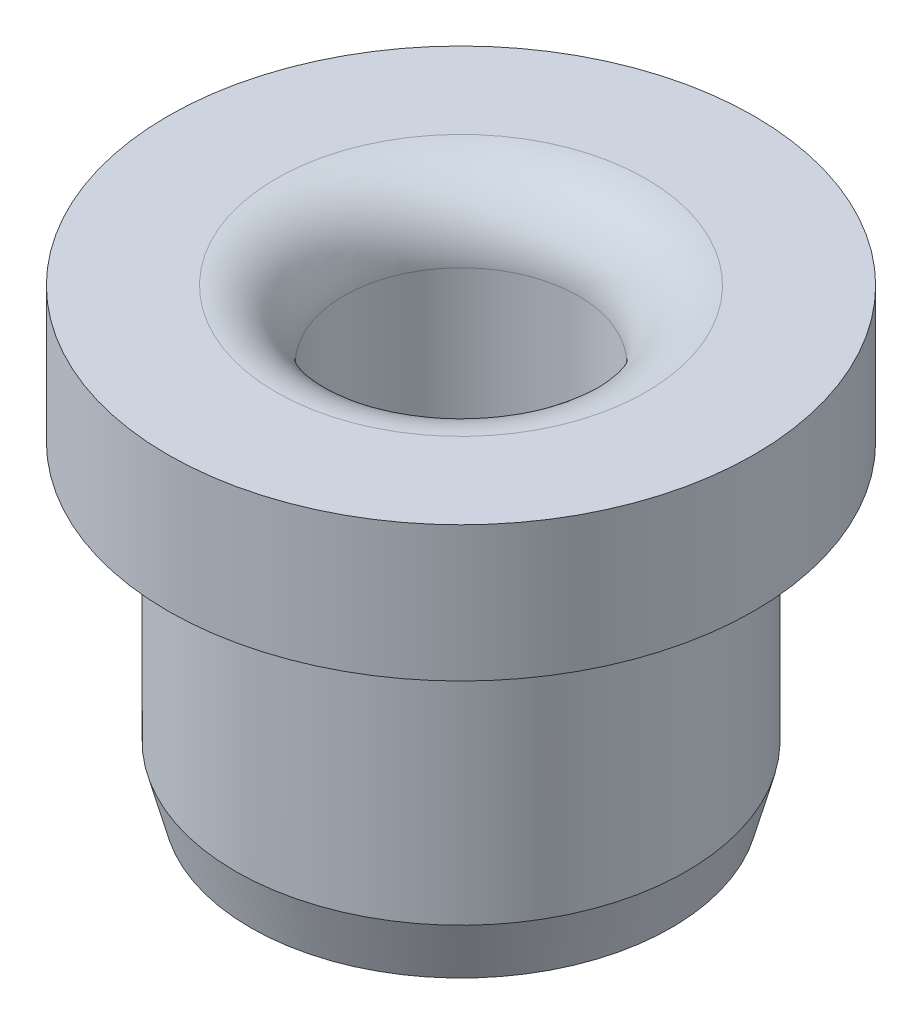
ISO-10303-21;
HEADER;
FILE_DESCRIPTION(('STEP AP214'),'2;1');
FILE_NAME('part.step','',(''),(''),'','','');
FILE_SCHEMA(('AUTOMOTIVE_DESIGN { 1 0 10303 214 1 1 1 1 }'));
ENDSEC;
DATA;
#1=APPLICATION_CONTEXT('core data for automotive mechanical design processes');
#2=APPLICATION_PROTOCOL_DEFINITION('international standard','automotive_design',2000,#1);
#3=PRODUCT_CONTEXT('',#1,'mechanical');
#4=PRODUCT('Part','Part','',(#3));
#5=PRODUCT_RELATED_PRODUCT_CATEGORY('part','',(#4));
#6=PRODUCT_DEFINITION_FORMATION('','',#4);
#7=PRODUCT_DEFINITION_CONTEXT('part definition',#1,'design');
#8=PRODUCT_DEFINITION('design','',#6,#7);
#9=PRODUCT_DEFINITION_SHAPE('','',#8);
#10=(LENGTH_UNIT() NAMED_UNIT(*) SI_UNIT(.MILLI.,.METRE.));
#11=(NAMED_UNIT(*) PLANE_ANGLE_UNIT() SI_UNIT($,.RADIAN.));
#12=(NAMED_UNIT(*) SI_UNIT($,.STERADIAN.) SOLID_ANGLE_UNIT());
#13=UNCERTAINTY_MEASURE_WITH_UNIT(LENGTH_MEASURE(1.E-05),#10,'distance_accuracy_value','');
#14=(GEOMETRIC_REPRESENTATION_CONTEXT(3) GLOBAL_UNCERTAINTY_ASSIGNED_CONTEXT((#13)) GLOBAL_UNIT_ASSIGNED_CONTEXT((#10,
#11,#12)) REPRESENTATION_CONTEXT('',''));
#15=CARTESIAN_POINT('',(0.,0.,0.));
#16=DIRECTION('',(0.,0.,1.));
#17=DIRECTION('',(1.,0.,0.));
#18=AXIS2_PLACEMENT_3D('',#15,#16,#17);
#19=CARTESIAN_POINT('',(0.,0.,0.));
#20=DIRECTION('',(0.,-1.,0.));
#21=DIRECTION('',(0.,0.,-1.));
#22=AXIS2_PLACEMENT_3D('',#19,#20,#21);
#23=CYLINDRICAL_SURFACE('',#22,5.);
#24=CARTESIAN_POINT('',(0.,-8.74999999996362,0.));
#25=DIRECTION('',(0.,1.,0.));
#26=DIRECTION('',(0.,0.,1.));
#27=AXIS2_PLACEMENT_3D('',#24,#25,#26);
#28=CIRCLE('',#27,5.0000000000523);
#29=CARTESIAN_POINT('',(0.,-8.74999999996362,5.0000000000523));
#30=VERTEX_POINT('',#29);
#31=EDGE_CURVE('E154',#30,#30,#28,.F.);
#32=ORIENTED_EDGE('',*,*,#31,.F.);
#33=EDGE_LOOP('',(#32));
#34=FACE_BOUND('',#33,.T.);
#35=CARTESIAN_POINT('',(0.,-3.99999999996226,0.));
#36=DIRECTION('',(0.,-1.,0.));
#37=DIRECTION('',(0.,0.,-1.));
#38=AXIS2_PLACEMENT_3D('',#35,#36,#37);
#39=CIRCLE('',#38,4.99999999993861);
#40=CARTESIAN_POINT('',(0.,-3.99999999996226,-4.99999999993861));
#41=VERTEX_POINT('',#40);
#42=EDGE_CURVE('E147',#41,#41,#39,.F.);
#43=ORIENTED_EDGE('',*,*,#42,.F.);
#44=EDGE_LOOP('',(#43));
#45=FACE_BOUND('',#44,.T.);
#46=ADVANCED_FACE('F16',(#34,#45),#23,.T.);
#47=CARTESIAN_POINT('',(0.,-8.74999999984993,0.));
#48=DIRECTION('',(0.,1.,0.));
#49=DIRECTION('',(0.,0.,1.));
#50=AXIS2_PLACEMENT_3D('',#47,#48,#49);
#51=CONICAL_SURFACE('',#50,5.00000000008072,0.26179938779827);
#52=ORIENTED_EDGE('',*,*,#31,.T.);
#53=EDGE_LOOP('',(#52));
#54=FACE_BOUND('',#53,.T.);
#55=CARTESIAN_POINT('',(0.,-10.0000000000477,0.));
#56=DIRECTION('',(0.,1.,0.));
#57=DIRECTION('',(0.,0.,1.));
#58=AXIS2_PLACEMENT_3D('',#55,#56,#57);
#59=CIRCLE('',#58,4.66506350948999);
#60=CARTESIAN_POINT('',(0.,-10.0000000000477,4.66506350948999));
#61=VERTEX_POINT('',#60);
#62=EDGE_CURVE('E144',#61,#61,#59,.F.);
#63=ORIENTED_EDGE('',*,*,#62,.F.);
#64=EDGE_LOOP('',(#63));
#65=FACE_BOUND('',#64,.T.);
#66=ADVANCED_FACE('F89',(#54,#65),#51,.T.);
#67=CARTESIAN_POINT('',(0.,-3.99999999990541,0.));
#68=DIRECTION('',(0.,-1.,0.));
#69=DIRECTION('',(0.,0.,-1.));
#70=AXIS2_PLACEMENT_3D('',#67,#68,#69);
#71=CONICAL_SURFACE('',#70,4.99999999988177,0.785398163397448);
#72=ORIENTED_EDGE('',*,*,#42,.T.);
#73=EDGE_LOOP('',(#72));
#74=FACE_BOUND('',#73,.T.);
#75=CARTESIAN_POINT('',(0.,-3.8,0.));
#76=DIRECTION('',(0.,-1.,0.));
#77=DIRECTION('',(0.,0.,-1.));
#78=AXIS2_PLACEMENT_3D('',#75,#76,#77);
#79=CIRCLE('',#78,4.8);
#80=CARTESIAN_POINT('',(0.,-3.8,-4.8));
#81=VERTEX_POINT('',#80);
#82=EDGE_CURVE('E143',#81,#81,#79,.F.);
#83=ORIENTED_EDGE('',*,*,#82,.F.);
#84=EDGE_LOOP('',(#83));
#85=FACE_BOUND('',#84,.T.);
#86=ADVANCED_FACE('F86',(#74,#85),#71,.T.);
#87=CARTESIAN_POINT('',(4.66506350946111,-10.,0.));
#88=DIRECTION('',(0.,-1.,0.));
#89=DIRECTION('',(0.,0.,-1.));
#90=AXIS2_PLACEMENT_3D('',#87,#88,#89);
#91=PLANE('',#90);
#92=CARTESIAN_POINT('',(0.,-10.,0.));
#93=DIRECTION('',(0.,1.,0.));
#94=DIRECTION('',(0.,0.,1.));
#95=AXIS2_PLACEMENT_3D('',#92,#93,#94);
#96=CIRCLE('',#95,2.6);
#97=CARTESIAN_POINT('',(0.,-10.,2.6));
#98=VERTEX_POINT('',#97);
#99=EDGE_CURVE('E139',#98,#98,#96,.T.);
#100=ORIENTED_EDGE('',*,*,#99,.T.);
#101=EDGE_LOOP('',(#100));
#102=FACE_BOUND('',#101,.T.);
#103=ORIENTED_EDGE('',*,*,#62,.T.);
#104=EDGE_LOOP('',(#103));
#105=FACE_BOUND('',#104,.T.);
#106=ADVANCED_FACE('F82',(#102,#105),#91,.T.);
#107=CARTESIAN_POINT('',(0.,0.,0.));
#108=DIRECTION('',(0.,-1.,0.));
#109=DIRECTION('',(0.,0.,-1.));
#110=AXIS2_PLACEMENT_3D('',#107,#108,#109);
#111=CYLINDRICAL_SURFACE('',#110,4.8);
#112=ORIENTED_EDGE('',*,*,#82,.T.);
#113=EDGE_LOOP('',(#112));
#114=FACE_BOUND('',#113,.T.);
#115=CARTESIAN_POINT('',(0.,-3.,0.));
#116=DIRECTION('',(0.,-1.,0.));
#117=DIRECTION('',(0.,0.,-1.));
#118=AXIS2_PLACEMENT_3D('',#115,#116,#117);
#119=CIRCLE('',#118,4.8);
#120=CARTESIAN_POINT('',(0.,-3.,-4.8));
#121=VERTEX_POINT('',#120);
#122=EDGE_CURVE('E133',#121,#121,#119,.T.);
#123=ORIENTED_EDGE('',*,*,#122,.T.);
#124=EDGE_LOOP('',(#123));
#125=FACE_BOUND('',#124,.T.);
#126=ADVANCED_FACE('F78',(#114,#125),#111,.T.);
#127=CARTESIAN_POINT('',(0.,0.,0.));
#128=DIRECTION('',(0.,1.,0.));
#129=DIRECTION('',(0.,0.,1.));
#130=AXIS2_PLACEMENT_3D('',#127,#128,#129);
#131=CYLINDRICAL_SURFACE('',#130,2.6);
#132=ORIENTED_EDGE('',*,*,#99,.F.);
#133=EDGE_LOOP('',(#132));
#134=FACE_BOUND('',#133,.T.);
#135=CARTESIAN_POINT('',(0.,-1.5,0.));
#136=DIRECTION('',(0.,1.,0.));
#137=DIRECTION('',(0.,0.,1.));
#138=AXIS2_PLACEMENT_3D('',#135,#136,#137);
#139=CIRCLE('',#138,2.6);
#140=CARTESIAN_POINT('',(0.,-1.5,2.6));
#141=VERTEX_POINT('',#140);
#142=EDGE_CURVE('E56',#141,#141,#139,.F.);
#143=ORIENTED_EDGE('',*,*,#142,.F.);
#144=EDGE_LOOP('',(#143));
#145=FACE_BOUND('',#144,.T.);
#146=ADVANCED_FACE('F74',(#134,#145),#131,.F.);
#147=CARTESIAN_POINT('',(6.5,-3.,0.));
#148=DIRECTION('',(0.,1.,0.));
#149=DIRECTION('',(0.,0.,1.));
#150=AXIS2_PLACEMENT_3D('',#147,#148,#149);
#151=PLANE('',#150);
#152=CARTESIAN_POINT('',(0.,-3.,0.));
#153=DIRECTION('',(0.,1.,0.));
#154=DIRECTION('',(0.,0.,1.));
#155=AXIS2_PLACEMENT_3D('',#152,#153,#154);
#156=CIRCLE('',#155,6.5);
#157=CARTESIAN_POINT('',(0.,-3.,6.5));
#158=VERTEX_POINT('',#157);
#159=EDGE_CURVE('E44',#158,#158,#156,.T.);
#160=ORIENTED_EDGE('',*,*,#159,.F.);
#161=EDGE_LOOP('',(#160));
#162=FACE_BOUND('',#161,.T.);
#163=ORIENTED_EDGE('',*,*,#122,.F.);
#164=EDGE_LOOP('',(#163));
#165=FACE_BOUND('',#164,.T.);
#166=ADVANCED_FACE('F68',(#162,#165),#151,.F.);
#167=CARTESIAN_POINT('',(0.,-1.5,0.));
#168=DIRECTION('',(0.,1.,0.));
#169=DIRECTION('',(0.,0.,1.));
#170=AXIS2_PLACEMENT_3D('',#167,#168,#169);
#171=TOROIDAL_SURFACE('',#170,4.1,1.5);
#172=ORIENTED_EDGE('',*,*,#142,.T.);
#173=EDGE_LOOP('',(#172));
#174=FACE_BOUND('',#173,.T.);
#175=CARTESIAN_POINT('',(0.,0.,0.));
#176=DIRECTION('',(0.,1.,0.));
#177=DIRECTION('',(0.,0.,1.));
#178=AXIS2_PLACEMENT_3D('',#175,#176,#177);
#179=CIRCLE('',#178,4.1);
#180=CARTESIAN_POINT('',(0.,0.,4.1));
#181=VERTEX_POINT('',#180);
#182=CARTESIAN_POINT('',(0.,0.,-4.1));
#183=VERTEX_POINT('',#182);
#184=EDGE_CURVE('E28',#181,#183,#179,.T.);
#185=ORIENTED_EDGE('',*,*,#184,.T.);
#186=CARTESIAN_POINT('',(0.,0.,0.));
#187=DIRECTION('',(0.,1.,0.));
#188=DIRECTION('',(0.,0.,-1.));
#189=AXIS2_PLACEMENT_3D('',#186,#187,#188);
#190=CIRCLE('',#189,4.1);
#191=EDGE_CURVE('E39',#183,#181,#190,.T.);
#192=ORIENTED_EDGE('',*,*,#191,.T.);
#193=EDGE_LOOP('',(#185,#192));
#194=FACE_BOUND('',#193,.T.);
#195=ADVANCED_FACE('F47',(#174,#194),#171,.T.);
#196=CARTESIAN_POINT('',(0.,0.,0.));
#197=DIRECTION('',(0.,1.,0.));
#198=DIRECTION('',(0.,0.,1.));
#199=AXIS2_PLACEMENT_3D('',#196,#197,#198);
#200=CYLINDRICAL_SURFACE('',#199,6.5);
#201=CARTESIAN_POINT('',(0.,0.,0.));
#202=DIRECTION('',(0.,1.,0.));
#203=DIRECTION('',(0.,0.,1.));
#204=AXIS2_PLACEMENT_3D('',#201,#202,#203);
#205=CIRCLE('',#204,6.5);
#206=CARTESIAN_POINT('',(0.,0.,6.5));
#207=VERTEX_POINT('',#206);
#208=EDGE_CURVE('E11',#207,#207,#205,.F.);
#209=ORIENTED_EDGE('',*,*,#208,.T.);
#210=EDGE_LOOP('',(#209));
#211=FACE_BOUND('',#210,.T.);
#212=ORIENTED_EDGE('',*,*,#159,.T.);
#213=EDGE_LOOP('',(#212));
#214=FACE_BOUND('',#213,.T.);
#215=ADVANCED_FACE('F67',(#211,#214),#200,.T.);
#216=CARTESIAN_POINT('',(4.1,0.,0.));
#217=DIRECTION('',(0.,-1.,0.));
#218=DIRECTION('',(0.,0.,-1.));
#219=AXIS2_PLACEMENT_3D('',#216,#217,#218);
#220=PLANE('',#219);
#221=ORIENTED_EDGE('',*,*,#208,.F.);
#222=EDGE_LOOP('',(#221));
#223=FACE_BOUND('',#222,.T.);
#224=ORIENTED_EDGE('',*,*,#191,.F.);
#225=ORIENTED_EDGE('',*,*,#184,.F.);
#226=EDGE_LOOP('',(#224,#225));
#227=FACE_BOUND('',#226,.T.);
#228=ADVANCED_FACE('F41',(#223,#227),#220,.F.);
#229=CLOSED_SHELL('',(#46,#66,#86,#106,#126,#146,#166,#195,#215,#228));
#230=MANIFOLD_SOLID_BREP('B1',#229);
#231=ADVANCED_BREP_SHAPE_REPRESENTATION('',(#18,#230),#14);
#232=SHAPE_DEFINITION_REPRESENTATION(#9,#231);
ENDSEC;
END-ISO-10303-21;
